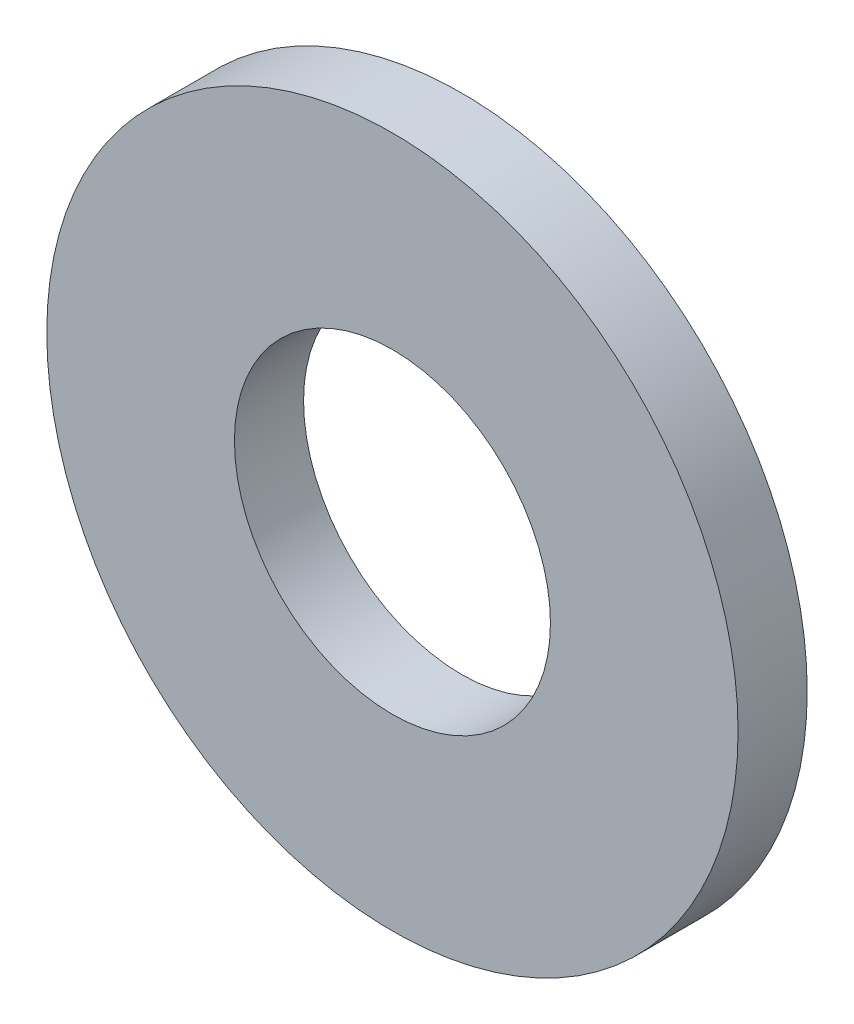
ISO-10303-21;
HEADER;
FILE_DESCRIPTION(('STEP AP214'),'2;1');
FILE_NAME('part.step','',(''),(''),'','','');
FILE_SCHEMA(('AUTOMOTIVE_DESIGN { 1 0 10303 214 1 1 1 1 }'));
ENDSEC;
DATA;
#1=APPLICATION_CONTEXT('core data for automotive mechanical design processes');
#2=APPLICATION_PROTOCOL_DEFINITION('international standard','automotive_design',2000,#1);
#3=PRODUCT_CONTEXT('',#1,'mechanical');
#4=PRODUCT('Part','Part','',(#3));
#5=PRODUCT_RELATED_PRODUCT_CATEGORY('part','',(#4));
#6=PRODUCT_DEFINITION_FORMATION('','',#4);
#7=PRODUCT_DEFINITION_CONTEXT('part definition',#1,'design');
#8=PRODUCT_DEFINITION('design','',#6,#7);
#9=PRODUCT_DEFINITION_SHAPE('','',#8);
#10=(LENGTH_UNIT() NAMED_UNIT(*) SI_UNIT(.MILLI.,.METRE.));
#11=(NAMED_UNIT(*) PLANE_ANGLE_UNIT() SI_UNIT($,.RADIAN.));
#12=(NAMED_UNIT(*) SI_UNIT($,.STERADIAN.) SOLID_ANGLE_UNIT());
#13=UNCERTAINTY_MEASURE_WITH_UNIT(LENGTH_MEASURE(1.E-05),#10,'distance_accuracy_value','');
#14=(GEOMETRIC_REPRESENTATION_CONTEXT(3) GLOBAL_UNCERTAINTY_ASSIGNED_CONTEXT((#13)) GLOBAL_UNIT_ASSIGNED_CONTEXT((#10,
#11,#12)) REPRESENTATION_CONTEXT('',''));
#15=CARTESIAN_POINT('',(0.,0.,0.));
#16=DIRECTION('',(0.,0.,1.));
#17=DIRECTION('',(1.,0.,0.));
#18=AXIS2_PLACEMENT_3D('',#15,#16,#17);
#19=CARTESIAN_POINT('',(0.,0.,0.7));
#20=DIRECTION('',(0.,0.,1.));
#21=DIRECTION('',(1.,0.,0.));
#22=AXIS2_PLACEMENT_3D('',#19,#20,#21);
#23=PLANE('',#22);
#24=CARTESIAN_POINT('',(0.,0.,0.7));
#25=DIRECTION('',(0.,0.,1.));
#26=DIRECTION('',(1.,0.,0.));
#27=AXIS2_PLACEMENT_3D('',#24,#25,#26);
#28=CIRCLE('',#27,3.5);
#29=CARTESIAN_POINT('',(3.5,0.,0.7));
#30=VERTEX_POINT('',#29);
#31=EDGE_CURVE('E10',#30,#30,#28,.T.);
#32=ORIENTED_EDGE('',*,*,#31,.T.);
#33=EDGE_LOOP('',(#32));
#34=FACE_BOUND('',#33,.T.);
#35=CARTESIAN_POINT('',(0.,0.,0.7));
#36=DIRECTION('',(0.,0.,1.));
#37=DIRECTION('',(1.,0.,0.));
#38=AXIS2_PLACEMENT_3D('',#35,#36,#37);
#39=CIRCLE('',#38,1.6);
#40=CARTESIAN_POINT('',(1.6,0.,0.7));
#41=VERTEX_POINT('',#40);
#42=EDGE_CURVE('E43',#41,#41,#39,.T.);
#43=ORIENTED_EDGE('',*,*,#42,.F.);
#44=EDGE_LOOP('',(#43));
#45=FACE_BOUND('',#44,.T.);
#46=ADVANCED_FACE('F32',(#34,#45),#23,.T.);
#47=CARTESIAN_POINT('',(0.,0.,0.));
#48=DIRECTION('',(0.,0.,1.));
#49=DIRECTION('',(1.,0.,0.));
#50=AXIS2_PLACEMENT_3D('',#47,#48,#49);
#51=PLANE('',#50);
#52=CARTESIAN_POINT('',(0.,0.,0.));
#53=DIRECTION('',(0.,0.,1.));
#54=DIRECTION('',(1.,0.,0.));
#55=AXIS2_PLACEMENT_3D('',#52,#53,#54);
#56=CIRCLE('',#55,3.5);
#57=CARTESIAN_POINT('',(3.5,0.,0.));
#58=VERTEX_POINT('',#57);
#59=EDGE_CURVE('E36',#58,#58,#56,.T.);
#60=ORIENTED_EDGE('',*,*,#59,.F.);
#61=EDGE_LOOP('',(#60));
#62=FACE_BOUND('',#61,.T.);
#63=CARTESIAN_POINT('',(0.,0.,0.));
#64=DIRECTION('',(0.,0.,1.));
#65=DIRECTION('',(1.,0.,0.));
#66=AXIS2_PLACEMENT_3D('',#63,#64,#65);
#67=CIRCLE('',#66,1.6);
#68=CARTESIAN_POINT('',(1.6,0.,0.));
#69=VERTEX_POINT('',#68);
#70=EDGE_CURVE('E45',#69,#69,#67,.T.);
#71=ORIENTED_EDGE('',*,*,#70,.T.);
#72=EDGE_LOOP('',(#71));
#73=FACE_BOUND('',#72,.T.);
#74=ADVANCED_FACE('F55',(#62,#73),#51,.F.);
#75=CARTESIAN_POINT('',(0.,0.,0.7));
#76=DIRECTION('',(0.,0.,-1.));
#77=DIRECTION('',(-1.,0.,0.));
#78=AXIS2_PLACEMENT_3D('',#75,#76,#77);
#79=CYLINDRICAL_SURFACE('',#78,3.5);
#80=ORIENTED_EDGE('',*,*,#31,.F.);
#81=EDGE_LOOP('',(#80));
#82=FACE_BOUND('',#81,.T.);
#83=ORIENTED_EDGE('',*,*,#59,.T.);
#84=EDGE_LOOP('',(#83));
#85=FACE_BOUND('',#84,.T.);
#86=ADVANCED_FACE('F34',(#82,#85),#79,.T.);
#87=CARTESIAN_POINT('',(0.,0.,0.7));
#88=DIRECTION('',(0.,0.,-1.));
#89=DIRECTION('',(-1.,0.,0.));
#90=AXIS2_PLACEMENT_3D('',#87,#88,#89);
#91=CYLINDRICAL_SURFACE('',#90,1.6);
#92=ORIENTED_EDGE('',*,*,#42,.T.);
#93=EDGE_LOOP('',(#92));
#94=FACE_BOUND('',#93,.T.);
#95=ORIENTED_EDGE('',*,*,#70,.F.);
#96=EDGE_LOOP('',(#95));
#97=FACE_BOUND('',#96,.T.);
#98=ADVANCED_FACE('F51',(#94,#97),#91,.F.);
#99=CLOSED_SHELL('',(#46,#74,#86,#98));
#100=MANIFOLD_SOLID_BREP('B2',#99);
#101=ADVANCED_BREP_SHAPE_REPRESENTATION('',(#18,#100),#14);
#102=SHAPE_DEFINITION_REPRESENTATION(#9,#101);
ENDSEC;
END-ISO-10303-21;
